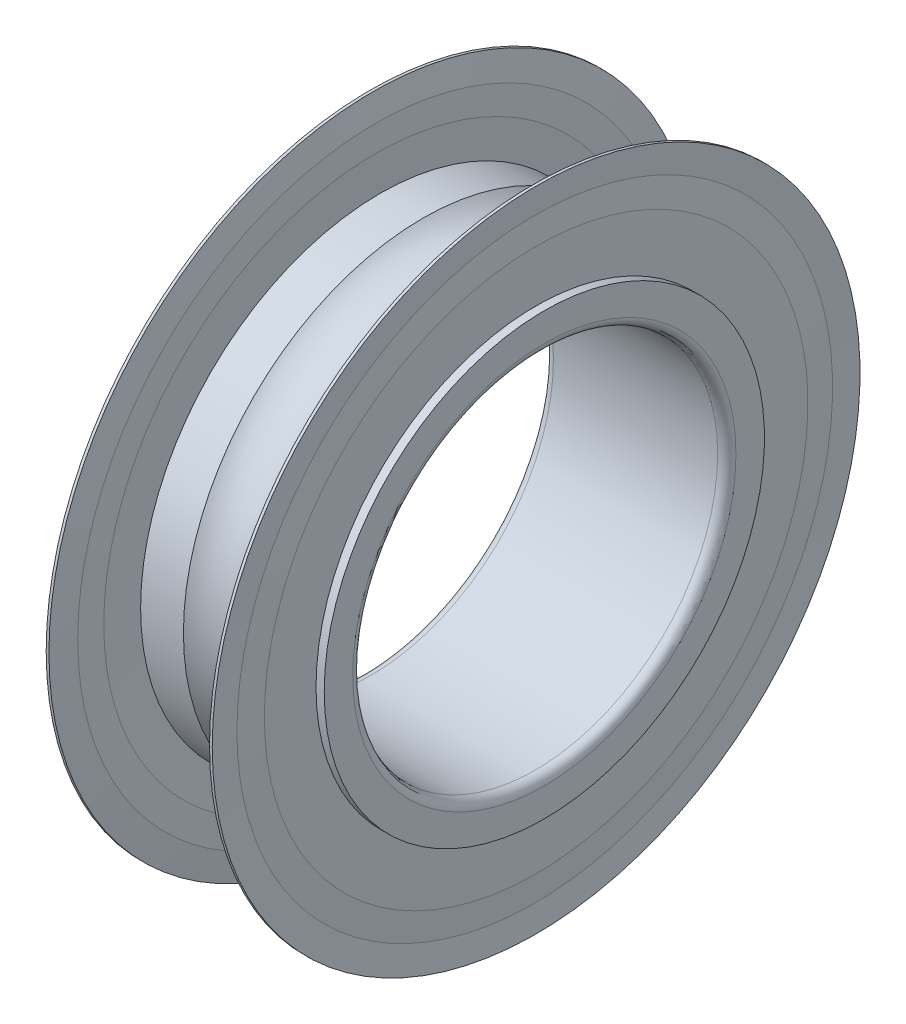
ISO-10303-21;
HEADER;
FILE_DESCRIPTION(('STEP AP214'),'2;1');
FILE_NAME('part.step','',(''),(''),'','','');
FILE_SCHEMA(('AUTOMOTIVE_DESIGN { 1 0 10303 214 1 1 1 1 }'));
ENDSEC;
DATA;
#1=APPLICATION_CONTEXT('core data for automotive mechanical design processes');
#2=APPLICATION_PROTOCOL_DEFINITION('international standard','automotive_design',2000,#1);
#3=PRODUCT_CONTEXT('',#1,'mechanical');
#4=PRODUCT('Part','Part','',(#3));
#5=PRODUCT_RELATED_PRODUCT_CATEGORY('part','',(#4));
#6=PRODUCT_DEFINITION_FORMATION('','',#4);
#7=PRODUCT_DEFINITION_CONTEXT('part definition',#1,'design');
#8=PRODUCT_DEFINITION('design','',#6,#7);
#9=PRODUCT_DEFINITION_SHAPE('','',#8);
#10=(LENGTH_UNIT() NAMED_UNIT(*) SI_UNIT(.MILLI.,.METRE.));
#11=(NAMED_UNIT(*) PLANE_ANGLE_UNIT() SI_UNIT($,.RADIAN.));
#12=(NAMED_UNIT(*) SI_UNIT($,.STERADIAN.) SOLID_ANGLE_UNIT());
#13=UNCERTAINTY_MEASURE_WITH_UNIT(LENGTH_MEASURE(1.E-05),#10,'distance_accuracy_value','');
#14=(GEOMETRIC_REPRESENTATION_CONTEXT(3) GLOBAL_UNCERTAINTY_ASSIGNED_CONTEXT((#13)) GLOBAL_UNIT_ASSIGNED_CONTEXT((#10,
#11,#12)) REPRESENTATION_CONTEXT('',''));
#15=CARTESIAN_POINT('',(0.,0.,0.));
#16=DIRECTION('',(0.,0.,1.));
#17=DIRECTION('',(1.,0.,0.));
#18=AXIS2_PLACEMENT_3D('',#15,#16,#17);
#19=CARTESIAN_POINT('',(0.,-4.825,-4.825));
#20=DIRECTION('',(-1.,0.,0.));
#21=DIRECTION('',(0.,0.,1.));
#22=AXIS2_PLACEMENT_3D('',#19,#20,#21);
#23=PLANE('',#22);
#24=CARTESIAN_POINT('',(0.,0.,0.));
#25=DIRECTION('',(-1.,0.,0.));
#26=DIRECTION('',(0.,0.,-1.));
#27=AXIS2_PLACEMENT_3D('',#24,#25,#26);
#28=CIRCLE('',#27,4.825);
#29=CARTESIAN_POINT('',(0.,0.,-4.825));
#30=VERTEX_POINT('',#29);
#31=EDGE_CURVE('E104',#30,#30,#28,.F.);
#32=ORIENTED_EDGE('',*,*,#31,.F.);
#33=EDGE_LOOP('',(#32));
#34=FACE_BOUND('',#33,.T.);
#35=CARTESIAN_POINT('',(0.,0.,0.));
#36=DIRECTION('',(1.,0.,0.));
#37=DIRECTION('',(0.,0.,1.));
#38=AXIS2_PLACEMENT_3D('',#35,#36,#37);
#39=CIRCLE('',#38,4.2);
#40=CARTESIAN_POINT('',(0.,0.,4.2));
#41=VERTEX_POINT('',#40);
#42=EDGE_CURVE('E101',#41,#41,#39,.T.);
#43=ORIENTED_EDGE('',*,*,#42,.T.);
#44=EDGE_LOOP('',(#43));
#45=FACE_BOUND('',#44,.T.);
#46=ADVANCED_FACE('F15',(#34,#45),#23,.T.);
#47=CARTESIAN_POINT('',(4.,-4.8249997657901,4.82500037109325));
#48=DIRECTION('',(1.,0.,0.));
#49=DIRECTION('',(0.,0.,-1.));
#50=AXIS2_PLACEMENT_3D('',#47,#48,#49);
#51=PLANE('',#50);
#52=CARTESIAN_POINT('',(4.,0.,0.));
#53=DIRECTION('',(1.,0.,0.));
#54=DIRECTION('',(0.,-1.42310903832655E-07,0.99999999999999));
#55=AXIS2_PLACEMENT_3D('',#52,#53,#54);
#56=CIRCLE('',#55,4.825);
#57=CARTESIAN_POINT('',(4.,-6.86650110992563E-07,4.82499999999995));
#58=VERTEX_POINT('',#57);
#59=EDGE_CURVE('E98',#58,#58,#56,.T.);
#60=ORIENTED_EDGE('',*,*,#59,.T.);
#61=EDGE_LOOP('',(#60));
#62=FACE_BOUND('',#61,.T.);
#63=CARTESIAN_POINT('',(4.,0.,0.));
#64=DIRECTION('',(-1.,0.,0.));
#65=DIRECTION('',(0.,0.,-1.));
#66=AXIS2_PLACEMENT_3D('',#63,#64,#65);
#67=CIRCLE('',#66,4.20000011099115);
#68=CARTESIAN_POINT('',(4.,0.,-4.20000011099115));
#69=VERTEX_POINT('',#68);
#70=EDGE_CURVE('E95',#69,#69,#67,.F.);
#71=ORIENTED_EDGE('',*,*,#70,.F.);
#72=EDGE_LOOP('',(#71));
#73=FACE_BOUND('',#72,.T.);
#74=ADVANCED_FACE('F112',(#62,#73),#51,.T.);
#75=CARTESIAN_POINT('',(0.4,-5.32082048514981,5.25000017536941));
#76=DIRECTION('',(-1.,0.,0.));
#77=DIRECTION('',(0.,1.,0.));
#78=AXIS2_PLACEMENT_3D('',#75,#76,#77);
#79=PLANE('',#78);
#80=CARTESIAN_POINT('',(0.4,0.,0.));
#81=DIRECTION('',(-1.,0.,0.));
#82=DIRECTION('',(0.,0.,-1.));
#83=AXIS2_PLACEMENT_3D('',#80,#81,#82);
#84=CIRCLE('',#83,5.25);
#85=CARTESIAN_POINT('',(0.4,0.,-5.25));
#86=VERTEX_POINT('',#85);
#87=EDGE_CURVE('E92',#86,#86,#84,.T.);
#88=ORIENTED_EDGE('',*,*,#87,.T.);
#89=EDGE_LOOP('',(#88));
#90=FACE_BOUND('',#89,.T.);
#91=CARTESIAN_POINT('',(0.4,0.,0.));
#92=DIRECTION('',(1.,0.,0.));
#93=DIRECTION('',(0.,-1.41990271560511E-07,0.99999999999999));
#94=AXIS2_PLACEMENT_3D('',#91,#92,#93);
#95=CIRCLE('',#94,4.9916666793302);
#96=CARTESIAN_POINT('',(0.4,-7.08768107337649E-07,4.99166667933015));
#97=VERTEX_POINT('',#96);
#98=EDGE_CURVE('E89',#97,#97,#95,.T.);
#99=ORIENTED_EDGE('',*,*,#98,.T.);
#100=EDGE_LOOP('',(#99));
#101=FACE_BOUND('',#100,.T.);
#102=ADVANCED_FACE('F367',(#90,#101),#79,.T.);
#103=CARTESIAN_POINT('',(3.6,-5.32082048514981,-5.25000017536941));
#104=DIRECTION('',(1.,0.,0.));
#105=DIRECTION('',(0.,1.,0.));
#106=AXIS2_PLACEMENT_3D('',#103,#104,#105);
#107=PLANE('',#106);
#108=CARTESIAN_POINT('',(3.6,0.,0.));
#109=DIRECTION('',(1.,0.,0.));
#110=DIRECTION('',(0.,0.,1.));
#111=AXIS2_PLACEMENT_3D('',#108,#109,#110);
#112=CIRCLE('',#111,5.25);
#113=CARTESIAN_POINT('',(3.6,0.,5.25));
#114=VERTEX_POINT('',#113);
#115=EDGE_CURVE('E86',#114,#114,#112,.T.);
#116=ORIENTED_EDGE('',*,*,#115,.T.);
#117=EDGE_LOOP('',(#116));
#118=FACE_BOUND('',#117,.T.);
#119=CARTESIAN_POINT('',(3.6,0.,0.));
#120=DIRECTION('',(-1.,0.,0.));
#121=DIRECTION('',(0.,0.,-1.));
#122=AXIS2_PLACEMENT_3D('',#119,#120,#121);
#123=CIRCLE('',#122,4.99166667957142);
#124=CARTESIAN_POINT('',(3.6,0.,-4.99166667957142));
#125=VERTEX_POINT('',#124);
#126=EDGE_CURVE('E83',#125,#125,#123,.F.);
#127=ORIENTED_EDGE('',*,*,#126,.F.);
#128=EDGE_LOOP('',(#127));
#129=FACE_BOUND('',#128,.T.);
#130=ADVANCED_FACE('F357',(#118,#129),#107,.T.);
#131=CARTESIAN_POINT('',(0.18,-6.12028247775235,-5.9575));
#132=DIRECTION('',(-1.,0.,0.));
#133=DIRECTION('',(0.,0.,1.));
#134=AXIS2_PLACEMENT_3D('',#131,#132,#133);
#135=PLANE('',#134);
#136=CARTESIAN_POINT('',(0.18,0.,0.));
#137=DIRECTION('',(-1.,0.,0.));
#138=DIRECTION('',(0.,0.,-1.));
#139=AXIS2_PLACEMENT_3D('',#136,#137,#138);
#140=CIRCLE('',#139,5.95750000000004);
#141=CARTESIAN_POINT('',(0.18,0.,-5.95750000000004));
#142=VERTEX_POINT('',#141);
#143=EDGE_CURVE('E80',#142,#142,#140,.F.);
#144=ORIENTED_EDGE('',*,*,#143,.F.);
#145=EDGE_LOOP('',(#144));
#146=FACE_BOUND('',#145,.T.);
#147=CARTESIAN_POINT('',(0.18,0.,0.));
#148=DIRECTION('',(1.,0.,0.));
#149=DIRECTION('',(0.,-1.42053889480427E-07,0.99999999999999));
#150=AXIS2_PLACEMENT_3D('',#147,#148,#149);
#151=CIRCLE('',#150,4.825);
#152=CARTESIAN_POINT('',(0.18,-6.85410016743059E-07,4.82499999999995));
#153=VERTEX_POINT('',#152);
#154=EDGE_CURVE('E77',#153,#153,#151,.F.);
#155=ORIENTED_EDGE('',*,*,#154,.F.);
#156=EDGE_LOOP('',(#155));
#157=FACE_BOUND('',#156,.T.);
#158=ADVANCED_FACE('F347',(#146,#157),#135,.T.);
#159=CARTESIAN_POINT('',(0.3,-6.70714127742983,6.52875));
#160=DIRECTION('',(1.,0.,0.));
#161=DIRECTION('',(0.,0.,-1.));
#162=AXIS2_PLACEMENT_3D('',#159,#160,#161);
#163=PLANE('',#162);
#164=CARTESIAN_POINT('',(0.3,0.,0.));
#165=DIRECTION('',(1.,0.,0.));
#166=DIRECTION('',(0.,-1.16853194638104E-09,1.));
#167=AXIS2_PLACEMENT_3D('',#164,#165,#166);
#168=CIRCLE('',#167,6.52875);
#169=CARTESIAN_POINT('',(0.3,-7.62905294493521E-09,6.52875));
#170=VERTEX_POINT('',#169);
#171=EDGE_CURVE('E74',#170,#170,#168,.T.);
#172=ORIENTED_EDGE('',*,*,#171,.T.);
#173=EDGE_LOOP('',(#172));
#174=FACE_BOUND('',#173,.T.);
#175=CARTESIAN_POINT('',(0.3,0.,0.));
#176=DIRECTION('',(-1.,0.,0.));
#177=DIRECTION('',(0.,0.,-1.));
#178=AXIS2_PLACEMENT_3D('',#175,#176,#177);
#179=CIRCLE('',#178,5.95749999999997);
#180=CARTESIAN_POINT('',(0.3,0.,-5.95749999999997));
#181=VERTEX_POINT('',#180);
#182=EDGE_CURVE('E71',#181,#181,#179,.F.);
#183=ORIENTED_EDGE('',*,*,#182,.F.);
#184=EDGE_LOOP('',(#183));
#185=FACE_BOUND('',#184,.T.);
#186=ADVANCED_FACE('F338',(#174,#185),#163,.T.);
#187=CARTESIAN_POINT('',(3.7,-6.7071412768129,-6.52875));
#188=DIRECTION('',(-1.,0.,0.));
#189=DIRECTION('',(0.,0.,1.));
#190=AXIS2_PLACEMENT_3D('',#187,#188,#189);
#191=PLANE('',#190);
#192=CARTESIAN_POINT('',(3.7,0.,0.));
#193=DIRECTION('',(-1.,0.,0.));
#194=DIRECTION('',(0.,0.,-1.));
#195=AXIS2_PLACEMENT_3D('',#192,#193,#194);
#196=CIRCLE('',#195,6.52874999999998);
#197=CARTESIAN_POINT('',(3.7,0.,-6.52874999999998));
#198=VERTEX_POINT('',#197);
#199=EDGE_CURVE('E68',#198,#198,#196,.F.);
#200=ORIENTED_EDGE('',*,*,#199,.F.);
#201=EDGE_LOOP('',(#200));
#202=FACE_BOUND('',#201,.T.);
#203=CARTESIAN_POINT('',(3.7,0.,0.));
#204=DIRECTION('',(1.,0.,0.));
#205=DIRECTION('',(0.,0.,1.));
#206=AXIS2_PLACEMENT_3D('',#203,#204,#205);
#207=CIRCLE('',#206,5.9575);
#208=CARTESIAN_POINT('',(3.7,0.,5.9575));
#209=VERTEX_POINT('',#208);
#210=EDGE_CURVE('E65',#209,#209,#207,.T.);
#211=ORIENTED_EDGE('',*,*,#210,.T.);
#212=EDGE_LOOP('',(#211));
#213=FACE_BOUND('',#212,.T.);
#214=ADVANCED_FACE('F130',(#202,#213),#191,.T.);
#215=CARTESIAN_POINT('',(3.82,-6.12028247775235,5.9575));
#216=DIRECTION('',(1.,0.,0.));
#217=DIRECTION('',(0.,0.,-1.));
#218=AXIS2_PLACEMENT_3D('',#215,#216,#217);
#219=PLANE('',#218);
#220=CARTESIAN_POINT('',(3.82,0.,0.));
#221=DIRECTION('',(1.,0.,0.));
#222=DIRECTION('',(0.,0.,1.));
#223=AXIS2_PLACEMENT_3D('',#220,#221,#222);
#224=CIRCLE('',#223,5.9575);
#225=CARTESIAN_POINT('',(3.82,0.,5.9575));
#226=VERTEX_POINT('',#225);
#227=EDGE_CURVE('E62',#226,#226,#224,.T.);
#228=ORIENTED_EDGE('',*,*,#227,.T.);
#229=EDGE_LOOP('',(#228));
#230=FACE_BOUND('',#229,.T.);
#231=CARTESIAN_POINT('',(3.82,0.,0.));
#232=DIRECTION('',(-1.,0.,0.));
#233=DIRECTION('',(0.,0.,-1.));
#234=AXIS2_PLACEMENT_3D('',#231,#232,#233);
#235=CIRCLE('',#234,4.825);
#236=CARTESIAN_POINT('',(3.82,0.,-4.825));
#237=VERTEX_POINT('',#236);
#238=EDGE_CURVE('E59',#237,#237,#235,.F.);
#239=ORIENTED_EDGE('',*,*,#238,.F.);
#240=EDGE_LOOP('',(#239));
#241=FACE_BOUND('',#240,.T.);
#242=ADVANCED_FACE('F119',(#230,#241),#219,.T.);
#243=CARTESIAN_POINT('',(0.200000000000016,0.,0.));
#244=DIRECTION('',(1.,0.,0.));
#245=DIRECTION('',(0.,0.,1.));
#246=AXIS2_PLACEMENT_3D('',#243,#244,#245);
#247=TOROIDAL_SURFACE('',#246,4.2,0.200000000000016);
#248=CARTESIAN_POINT('',(0.2,0.,0.));
#249=DIRECTION('',(1.,0.,0.));
#250=DIRECTION('',(0.,0.,1.));
#251=AXIS2_PLACEMENT_3D('',#248,#249,#250);
#252=CIRCLE('',#251,3.99999999999998);
#253=CARTESIAN_POINT('',(0.2,0.,3.99999999999998));
#254=VERTEX_POINT('',#253);
#255=EDGE_CURVE('E56',#254,#254,#252,.T.);
#256=ORIENTED_EDGE('',*,*,#255,.T.);
#257=EDGE_LOOP('',(#256));
#258=FACE_BOUND('',#257,.T.);
#259=ORIENTED_EDGE('',*,*,#42,.F.);
#260=EDGE_LOOP('',(#259));
#261=FACE_BOUND('',#260,.T.);
#262=ADVANCED_FACE('F116',(#258,#261),#247,.T.);
#263=CARTESIAN_POINT('',(50.,0.,0.));
#264=DIRECTION('',(1.,0.,0.));
#265=DIRECTION('',(0.,0.,1.));
#266=AXIS2_PLACEMENT_3D('',#263,#264,#265);
#267=CYLINDRICAL_SURFACE('',#266,4.);
#268=CARTESIAN_POINT('',(3.8,0.,0.));
#269=DIRECTION('',(1.,0.,0.));
#270=DIRECTION('',(0.,0.,1.));
#271=AXIS2_PLACEMENT_3D('',#268,#269,#270);
#272=CIRCLE('',#271,4.);
#273=CARTESIAN_POINT('',(3.8,0.,4.));
#274=VERTEX_POINT('',#273);
#275=EDGE_CURVE('E53',#274,#274,#272,.T.);
#276=ORIENTED_EDGE('',*,*,#275,.T.);
#277=EDGE_LOOP('',(#276));
#278=FACE_BOUND('',#277,.T.);
#279=ORIENTED_EDGE('',*,*,#255,.F.);
#280=EDGE_LOOP('',(#279));
#281=FACE_BOUND('',#280,.T.);
#282=ADVANCED_FACE('F118',(#278,#281),#267,.F.);
#283=CARTESIAN_POINT('',(3.8,0.,0.));
#284=DIRECTION('',(1.,0.,0.));
#285=DIRECTION('',(0.,0.,1.));
#286=AXIS2_PLACEMENT_3D('',#283,#284,#285);
#287=TOROIDAL_SURFACE('',#286,4.2,0.200000000000031);
#288=ORIENTED_EDGE('',*,*,#70,.T.);
#289=EDGE_LOOP('',(#288));
#290=FACE_BOUND('',#289,.T.);
#291=ORIENTED_EDGE('',*,*,#275,.F.);
#292=EDGE_LOOP('',(#291));
#293=FACE_BOUND('',#292,.T.);
#294=ADVANCED_FACE('F127',(#290,#293),#287,.T.);
#295=CARTESIAN_POINT('',(50.,0.,0.));
#296=DIRECTION('',(1.,0.,0.));
#297=DIRECTION('',(0.,0.,1.));
#298=AXIS2_PLACEMENT_3D('',#295,#296,#297);
#299=CYLINDRICAL_SURFACE('',#298,4.825);
#300=ORIENTED_EDGE('',*,*,#154,.T.);
#301=EDGE_LOOP('',(#300));
#302=FACE_BOUND('',#301,.T.);
#303=ORIENTED_EDGE('',*,*,#31,.T.);
#304=EDGE_LOOP('',(#303));
#305=FACE_BOUND('',#304,.T.);
#306=ADVANCED_FACE('F108',(#302,#305),#299,.T.);
#307=CARTESIAN_POINT('',(0.233333333333347,0.,0.));
#308=DIRECTION('',(1.,0.,0.));
#309=DIRECTION('',(0.,0.,1.));
#310=AXIS2_PLACEMENT_3D('',#307,#308,#309);
#311=TOROIDAL_SURFACE('',#310,4.99166666666665,0.166666666666654);
#312=ORIENTED_EDGE('',*,*,#98,.F.);
#313=EDGE_LOOP('',(#312));
#314=FACE_BOUND('',#313,.T.);
#315=CARTESIAN_POINT('',(0.240533335284631,0.,0.));
#316=DIRECTION('',(1.,0.,0.));
#317=DIRECTION('',(0.,0.,1.));
#318=AXIS2_PLACEMENT_3D('',#315,#316,#317);
#319=CIRCLE('',#318,4.82515559271157);
#320=CARTESIAN_POINT('',(0.240533335284631,0.,4.82515559271157));
#321=VERTEX_POINT('',#320);
#322=EDGE_CURVE('E50',#321,#321,#319,.T.);
#323=ORIENTED_EDGE('',*,*,#322,.T.);
#324=EDGE_LOOP('',(#323));
#325=FACE_BOUND('',#324,.T.);
#326=ADVANCED_FACE('F140',(#314,#325),#311,.F.);
#327=CARTESIAN_POINT('',(3.76666666666664,0.,0.));
#328=DIRECTION('',(1.,0.,0.));
#329=DIRECTION('',(0.,0.,1.));
#330=AXIS2_PLACEMENT_3D('',#327,#328,#329);
#331=TOROIDAL_SURFACE('',#330,4.99166666666664,0.166666666666635);
#332=CARTESIAN_POINT('',(3.75946666471537,0.,0.));
#333=DIRECTION('',(-1.,0.,0.));
#334=DIRECTION('',(0.,0.,-1.));
#335=AXIS2_PLACEMENT_3D('',#332,#333,#334);
#336=CIRCLE('',#335,4.82515559271157);
#337=CARTESIAN_POINT('',(3.75946666471537,0.,-4.82515559271157));
#338=VERTEX_POINT('',#337);
#339=EDGE_CURVE('E47',#338,#338,#336,.T.);
#340=ORIENTED_EDGE('',*,*,#339,.T.);
#341=EDGE_LOOP('',(#340));
#342=FACE_BOUND('',#341,.T.);
#343=ORIENTED_EDGE('',*,*,#126,.T.);
#344=EDGE_LOOP('',(#343));
#345=FACE_BOUND('',#344,.T.);
#346=ADVANCED_FACE('F144',(#342,#345),#331,.F.);
#347=CARTESIAN_POINT('',(50.,0.,0.));
#348=DIRECTION('',(1.,0.,0.));
#349=DIRECTION('',(0.,0.,1.));
#350=AXIS2_PLACEMENT_3D('',#347,#348,#349);
#351=CYLINDRICAL_SURFACE('',#350,4.825);
#352=ORIENTED_EDGE('',*,*,#59,.F.);
#353=EDGE_LOOP('',(#352));
#354=FACE_BOUND('',#353,.T.);
#355=ORIENTED_EDGE('',*,*,#238,.T.);
#356=EDGE_LOOP('',(#355));
#357=FACE_BOUND('',#356,.T.);
#358=ADVANCED_FACE('F148',(#354,#357),#351,.T.);
#359=CARTESIAN_POINT('',(50.,0.,0.));
#360=DIRECTION('',(1.,0.,0.));
#361=DIRECTION('',(0.,0.,1.));
#362=AXIS2_PLACEMENT_3D('',#359,#360,#361);
#363=CYLINDRICAL_SURFACE('',#362,5.25);
#364=CARTESIAN_POINT('',(2.6614378277661,0.,0.));
#365=DIRECTION('',(1.,0.,0.));
#366=DIRECTION('',(0.,0.,1.));
#367=AXIS2_PLACEMENT_3D('',#364,#365,#366);
#368=CIRCLE('',#367,5.25);
#369=CARTESIAN_POINT('',(2.6614378277661,0.,5.25));
#370=VERTEX_POINT('',#369);
#371=EDGE_CURVE('E44',#370,#370,#368,.T.);
#372=ORIENTED_EDGE('',*,*,#371,.T.);
#373=EDGE_LOOP('',(#372));
#374=FACE_BOUND('',#373,.T.);
#375=ORIENTED_EDGE('',*,*,#115,.F.);
#376=EDGE_LOOP('',(#375));
#377=FACE_BOUND('',#376,.T.);
#378=ADVANCED_FACE('F152',(#374,#377),#363,.T.);
#379=CARTESIAN_POINT('',(2.,0.,0.));
#380=DIRECTION('',(1.,0.,0.));
#381=DIRECTION('',(0.,0.,1.));
#382=AXIS2_PLACEMENT_3D('',#379,#380,#381);
#383=TOROIDAL_SURFACE('',#382,5.99999999999987,0.999999999999873);
#384=ORIENTED_EDGE('',*,*,#371,.F.);
#385=EDGE_LOOP('',(#384));
#386=FACE_BOUND('',#385,.T.);
#387=CARTESIAN_POINT('',(1.3385621722339,0.,0.));
#388=DIRECTION('',(1.,0.,0.));
#389=DIRECTION('',(0.,0.,1.));
#390=AXIS2_PLACEMENT_3D('',#387,#388,#389);
#391=CIRCLE('',#390,5.25);
#392=CARTESIAN_POINT('',(1.3385621722339,0.,5.25));
#393=VERTEX_POINT('',#392);
#394=EDGE_CURVE('E41',#393,#393,#391,.T.);
#395=ORIENTED_EDGE('',*,*,#394,.T.);
#396=EDGE_LOOP('',(#395));
#397=FACE_BOUND('',#396,.T.);
#398=ADVANCED_FACE('F156',(#386,#397),#383,.F.);
#399=CARTESIAN_POINT('',(50.,0.,0.));
#400=DIRECTION('',(1.,0.,0.));
#401=DIRECTION('',(0.,1.420367278352E-07,0.99999999999999));
#402=AXIS2_PLACEMENT_3D('',#399,#400,#401);
#403=CYLINDRICAL_SURFACE('',#402,5.25);
#404=ORIENTED_EDGE('',*,*,#87,.F.);
#405=EDGE_LOOP('',(#404));
#406=FACE_BOUND('',#405,.T.);
#407=ORIENTED_EDGE('',*,*,#394,.F.);
#408=EDGE_LOOP('',(#407));
#409=FACE_BOUND('',#408,.T.);
#410=ADVANCED_FACE('F160',(#406,#409),#403,.T.);
#411=CARTESIAN_POINT('',(0.300000000000002,0.,0.));
#412=DIRECTION('',(1.,0.,0.));
#413=DIRECTION('',(0.,0.,1.));
#414=AXIS2_PLACEMENT_3D('',#411,#412,#413);
#415=CONICAL_SURFACE('',#414,5.9575,1.51832811530404);
#416=ORIENTED_EDGE('',*,*,#182,.T.);
#417=EDGE_LOOP('',(#416));
#418=FACE_BOUND('',#417,.T.);
#419=ORIENTED_EDGE('',*,*,#322,.F.);
#420=EDGE_LOOP('',(#419));
#421=FACE_BOUND('',#420,.T.);
#422=ADVANCED_FACE('F164',(#418,#421),#415,.F.);
#423=CARTESIAN_POINT('',(50.,0.,0.));
#424=DIRECTION('',(1.,0.,0.));
#425=DIRECTION('',(0.,0.,1.));
#426=AXIS2_PLACEMENT_3D('',#423,#424,#425);
#427=CYLINDRICAL_SURFACE('',#426,7.1);
#428=CARTESIAN_POINT('',(0.18,0.,0.));
#429=DIRECTION('',(1.,0.,0.));
#430=DIRECTION('',(0.,0.,1.));
#431=AXIS2_PLACEMENT_3D('',#428,#429,#430);
#432=CIRCLE('',#431,7.1);
#433=CARTESIAN_POINT('',(0.18,0.,7.1));
#434=VERTEX_POINT('',#433);
#435=EDGE_CURVE('E38',#434,#434,#432,.T.);
#436=ORIENTED_EDGE('',*,*,#435,.T.);
#437=EDGE_LOOP('',(#436));
#438=FACE_BOUND('',#437,.T.);
#439=CARTESIAN_POINT('',(0.239999999999995,0.,0.));
#440=DIRECTION('',(-1.,0.,0.));
#441=DIRECTION('',(0.,0.,-1.));
#442=AXIS2_PLACEMENT_3D('',#439,#440,#441);
#443=CIRCLE('',#442,7.1);
#444=CARTESIAN_POINT('',(0.239999999999995,0.,-7.1));
#445=VERTEX_POINT('',#444);
#446=EDGE_CURVE('E35',#445,#445,#443,.F.);
#447=ORIENTED_EDGE('',*,*,#446,.F.);
#448=EDGE_LOOP('',(#447));
#449=FACE_BOUND('',#448,.T.);
#450=ADVANCED_FACE('F168',(#438,#449),#427,.T.);
#451=CARTESIAN_POINT('',(0.18,0.,0.));
#452=DIRECTION('',(-1.,0.,0.));
#453=DIRECTION('',(0.,0.,-1.));
#454=AXIS2_PLACEMENT_3D('',#451,#452,#453);
#455=CONICAL_SURFACE('',#454,7.1,1.51832811530404);
#456=ORIENTED_EDGE('',*,*,#435,.F.);
#457=EDGE_LOOP('',(#456));
#458=FACE_BOUND('',#457,.T.);
#459=CARTESIAN_POINT('',(0.210000000000002,0.,0.));
#460=DIRECTION('',(1.,0.,0.));
#461=DIRECTION('',(0.,0.,1.));
#462=AXIS2_PLACEMENT_3D('',#459,#460,#461);
#463=CIRCLE('',#462,6.52875);
#464=CARTESIAN_POINT('',(0.210000000000002,0.,6.52875));
#465=VERTEX_POINT('',#464);
#466=EDGE_CURVE('E30',#465,#465,#463,.T.);
#467=ORIENTED_EDGE('',*,*,#466,.T.);
#468=EDGE_LOOP('',(#467));
#469=FACE_BOUND('',#468,.T.);
#470=ADVANCED_FACE('F172',(#458,#469),#455,.F.);
#471=CARTESIAN_POINT('',(0.21,0.,0.));
#472=DIRECTION('',(1.,0.,0.));
#473=DIRECTION('',(0.,0.,1.));
#474=AXIS2_PLACEMENT_3D('',#471,#472,#473);
#475=CONICAL_SURFACE('',#474,6.52875,1.51832811530404);
#476=ORIENTED_EDGE('',*,*,#143,.T.);
#477=EDGE_LOOP('',(#476));
#478=FACE_BOUND('',#477,.T.);
#479=ORIENTED_EDGE('',*,*,#466,.F.);
#480=EDGE_LOOP('',(#479));
#481=FACE_BOUND('',#480,.T.);
#482=ADVANCED_FACE('F176',(#478,#481),#475,.T.);
#483=CARTESIAN_POINT('',(0.239999999999995,0.,0.));
#484=DIRECTION('',(-1.,0.,0.));
#485=DIRECTION('',(0.,0.,-1.));
#486=AXIS2_PLACEMENT_3D('',#483,#484,#485);
#487=CONICAL_SURFACE('',#486,7.1,1.46614720444071);
#488=ORIENTED_EDGE('',*,*,#446,.T.);
#489=EDGE_LOOP('',(#488));
#490=FACE_BOUND('',#489,.T.);
#491=ORIENTED_EDGE('',*,*,#171,.F.);
#492=EDGE_LOOP('',(#491));
#493=FACE_BOUND('',#492,.T.);
#494=ADVANCED_FACE('F180',(#490,#493),#487,.T.);
#495=CARTESIAN_POINT('',(3.7,0.,0.));
#496=DIRECTION('',(-1.,0.,0.));
#497=DIRECTION('',(0.,7.69388231243592E-10,-1.));
#498=AXIS2_PLACEMENT_3D('',#495,#496,#497);
#499=CONICAL_SURFACE('',#498,5.9575,1.51832811530404);
#500=ORIENTED_EDGE('',*,*,#339,.F.);
#501=EDGE_LOOP('',(#500));
#502=FACE_BOUND('',#501,.T.);
#503=ORIENTED_EDGE('',*,*,#210,.F.);
#504=EDGE_LOOP('',(#503));
#505=FACE_BOUND('',#504,.T.);
#506=ADVANCED_FACE('F184',(#502,#505),#499,.F.);
#507=CARTESIAN_POINT('',(3.76,0.,0.));
#508=DIRECTION('',(1.,0.,0.));
#509=DIRECTION('',(0.,1.92334715161532E-10,1.));
#510=AXIS2_PLACEMENT_3D('',#507,#508,#509);
#511=CONICAL_SURFACE('',#510,7.1,1.46614720444072);
#512=ORIENTED_EDGE('',*,*,#199,.T.);
#513=EDGE_LOOP('',(#512));
#514=FACE_BOUND('',#513,.T.);
#515=CARTESIAN_POINT('',(3.76,0.,0.));
#516=DIRECTION('',(-1.,0.,0.));
#517=DIRECTION('',(0.,0.,-1.));
#518=AXIS2_PLACEMENT_3D('',#515,#516,#517);
#519=CIRCLE('',#518,7.1);
#520=CARTESIAN_POINT('',(3.76,0.,-7.1));
#521=VERTEX_POINT('',#520);
#522=EDGE_CURVE('E26',#521,#521,#519,.F.);
#523=ORIENTED_EDGE('',*,*,#522,.F.);
#524=EDGE_LOOP('',(#523));
#525=FACE_BOUND('',#524,.T.);
#526=ADVANCED_FACE('F188',(#514,#525),#511,.T.);
#527=CARTESIAN_POINT('',(3.79,0.,0.));
#528=DIRECTION('',(-1.,0.,0.));
#529=DIRECTION('',(0.,0.,-1.));
#530=AXIS2_PLACEMENT_3D('',#527,#528,#529);
#531=CONICAL_SURFACE('',#530,6.52875,1.51832811530405);
#532=ORIENTED_EDGE('',*,*,#227,.F.);
#533=EDGE_LOOP('',(#532));
#534=FACE_BOUND('',#533,.T.);
#535=CARTESIAN_POINT('',(3.79,0.,0.));
#536=DIRECTION('',(1.,0.,0.));
#537=DIRECTION('',(0.,0.,1.));
#538=AXIS2_PLACEMENT_3D('',#535,#536,#537);
#539=CIRCLE('',#538,6.52875);
#540=CARTESIAN_POINT('',(3.79,0.,6.52875));
#541=VERTEX_POINT('',#540);
#542=EDGE_CURVE('E22',#541,#541,#539,.T.);
#543=ORIENTED_EDGE('',*,*,#542,.T.);
#544=EDGE_LOOP('',(#543));
#545=FACE_BOUND('',#544,.T.);
#546=ADVANCED_FACE('F192',(#534,#545),#531,.T.);
#547=CARTESIAN_POINT('',(3.82,0.,0.));
#548=DIRECTION('',(1.,0.,0.));
#549=DIRECTION('',(0.,0.,1.));
#550=AXIS2_PLACEMENT_3D('',#547,#548,#549);
#551=CONICAL_SURFACE('',#550,7.10000000000001,1.51832811530405);
#552=CARTESIAN_POINT('',(3.82,0.,0.));
#553=DIRECTION('',(1.,0.,0.));
#554=DIRECTION('',(0.,0.,1.));
#555=AXIS2_PLACEMENT_3D('',#552,#553,#554);
#556=CIRCLE('',#555,7.10000000000001);
#557=CARTESIAN_POINT('',(3.82,0.,7.10000000000001));
#558=VERTEX_POINT('',#557);
#559=EDGE_CURVE('E10',#558,#558,#556,.T.);
#560=ORIENTED_EDGE('',*,*,#559,.T.);
#561=EDGE_LOOP('',(#560));
#562=FACE_BOUND('',#561,.T.);
#563=ORIENTED_EDGE('',*,*,#542,.F.);
#564=EDGE_LOOP('',(#563));
#565=FACE_BOUND('',#564,.T.);
#566=ADVANCED_FACE('F195',(#562,#565),#551,.F.);
#567=CARTESIAN_POINT('',(50.,0.,0.));
#568=DIRECTION('',(1.,0.,0.));
#569=DIRECTION('',(0.,7.69338937341299E-10,1.));
#570=AXIS2_PLACEMENT_3D('',#567,#568,#569);
#571=CYLINDRICAL_SURFACE('',#570,7.1);
#572=ORIENTED_EDGE('',*,*,#522,.T.);
#573=EDGE_LOOP('',(#572));
#574=FACE_BOUND('',#573,.T.);
#575=ORIENTED_EDGE('',*,*,#559,.F.);
#576=EDGE_LOOP('',(#575));
#577=FACE_BOUND('',#576,.T.);
#578=ADVANCED_FACE('F17',(#574,#577),#571,.T.);
#579=CLOSED_SHELL('',(#46,#74,#102,#130,#158,#186,#214,#242,#262,#282,#294,#306,#326,#346,#358,
#378,#398,#410,#422,#450,#470,#482,#494,#506,#526,#546,#566,#578));
#580=MANIFOLD_SOLID_BREP('B1',#579);
#581=ADVANCED_BREP_SHAPE_REPRESENTATION('',(#18,#580),#14);
#582=SHAPE_DEFINITION_REPRESENTATION(#9,#581);
ENDSEC;
END-ISO-10303-21;
